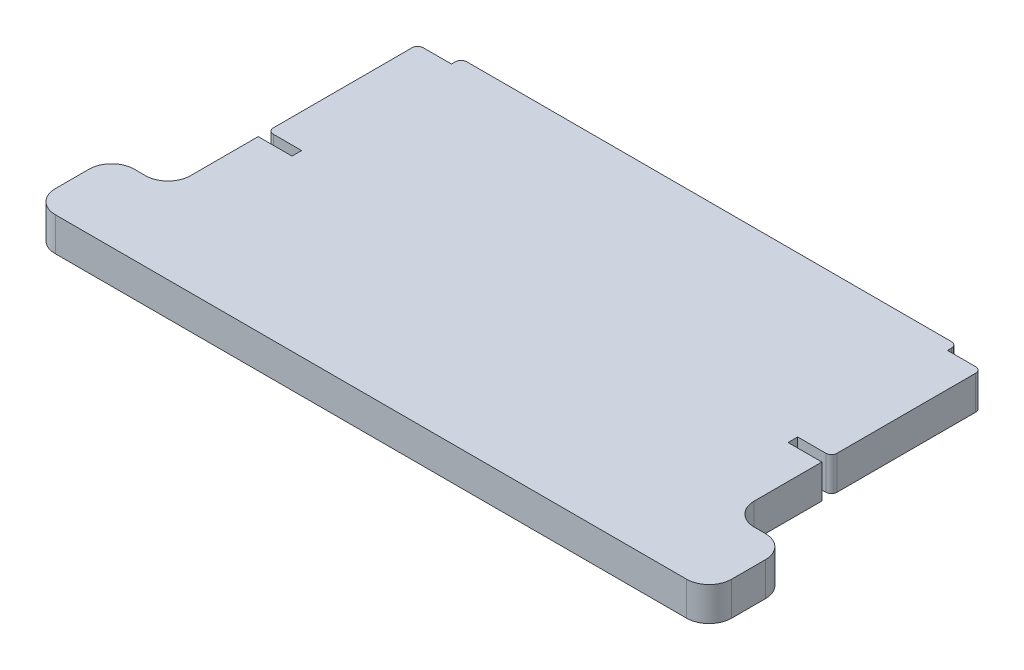
ISO-10303-21;
HEADER;
FILE_DESCRIPTION(('STEP AP214'),'2;1');
FILE_NAME('part.step','',(''),(''),'','','');
FILE_SCHEMA(('AUTOMOTIVE_DESIGN { 1 0 10303 214 1 1 1 1 }'));
ENDSEC;
DATA;
#1=APPLICATION_CONTEXT('core data for automotive mechanical design processes');
#2=APPLICATION_PROTOCOL_DEFINITION('international standard','automotive_design',2000,#1);
#3=PRODUCT_CONTEXT('',#1,'mechanical');
#4=PRODUCT('Part','Part','',(#3));
#5=PRODUCT_RELATED_PRODUCT_CATEGORY('part','',(#4));
#6=PRODUCT_DEFINITION_FORMATION('','',#4);
#7=PRODUCT_DEFINITION_CONTEXT('part definition',#1,'design');
#8=PRODUCT_DEFINITION('design','',#6,#7);
#9=PRODUCT_DEFINITION_SHAPE('','',#8);
#10=(LENGTH_UNIT() NAMED_UNIT(*) SI_UNIT(.MILLI.,.METRE.));
#11=(NAMED_UNIT(*) PLANE_ANGLE_UNIT() SI_UNIT($,.RADIAN.));
#12=(NAMED_UNIT(*) SI_UNIT($,.STERADIAN.) SOLID_ANGLE_UNIT());
#13=UNCERTAINTY_MEASURE_WITH_UNIT(LENGTH_MEASURE(1.E-05),#10,'distance_accuracy_value','');
#14=(GEOMETRIC_REPRESENTATION_CONTEXT(3) GLOBAL_UNCERTAINTY_ASSIGNED_CONTEXT((#13)) GLOBAL_UNIT_ASSIGNED_CONTEXT((#10,
#11,#12)) REPRESENTATION_CONTEXT('',''));
#15=CARTESIAN_POINT('',(0.,0.,0.));
#16=DIRECTION('',(0.,0.,1.));
#17=DIRECTION('',(1.,0.,0.));
#18=AXIS2_PLACEMENT_3D('',#15,#16,#17);
#19=CARTESIAN_POINT('',(25.,1.5,-15.));
#20=DIRECTION('',(-1.,0.,0.));
#21=DIRECTION('',(0.,0.,1.));
#22=AXIS2_PLACEMENT_3D('',#19,#20,#21);
#23=PLANE('',#22);
#24=DIRECTION('',(0.,0.,-1.));
#25=VECTOR('',#24,1.);
#26=CARTESIAN_POINT('',(25.,-1.5,-15.));
#27=LINE('',#26,#25);
#28=CARTESIAN_POINT('',(25.,-1.5,-1.35319331840469));
#29=VERTEX_POINT('',#28);
#30=CARTESIAN_POINT('',(25.,-1.5,-13.6468066815953));
#31=VERTEX_POINT('',#30);
#32=EDGE_CURVE('E380',#29,#31,#27,.T.);
#33=ORIENTED_EDGE('',*,*,#32,.T.);
#34=DIRECTION('',(0.,1.,0.));
#35=VECTOR('',#34,1.);
#36=CARTESIAN_POINT('',(25.,1.5,-13.6468066815953));
#37=LINE('',#36,#35);
#38=CARTESIAN_POINT('',(25.,1.5,-13.6468066815953));
#39=VERTEX_POINT('',#38);
#40=EDGE_CURVE('E357',#31,#39,#37,.T.);
#41=ORIENTED_EDGE('',*,*,#40,.T.);
#42=DIRECTION('',(0.,0.,-1.));
#43=VECTOR('',#42,1.);
#44=CARTESIAN_POINT('',(25.,1.5,-15.));
#45=LINE('',#44,#43);
#46=CARTESIAN_POINT('',(25.,1.5,-1.35319331840469));
#47=VERTEX_POINT('',#46);
#48=EDGE_CURVE('E296',#47,#39,#45,.T.);
#49=ORIENTED_EDGE('',*,*,#48,.F.);
#50=DIRECTION('',(0.,1.,0.));
#51=VECTOR('',#50,1.);
#52=CARTESIAN_POINT('',(25.,1.5,-1.35319331840469));
#53=LINE('',#52,#51);
#54=EDGE_CURVE('E355',#47,#29,#53,.F.);
#55=ORIENTED_EDGE('',*,*,#54,.T.);
#56=EDGE_LOOP('',(#33,#41,#49,#55));
#57=FACE_BOUND('',#56,.T.);
#58=ADVANCED_FACE('F36',(#57),#23,.F.);
#59=CARTESIAN_POINT('',(-25.,1.5,8.00000000000001));
#60=DIRECTION('',(1.,0.,0.));
#61=DIRECTION('',(0.,0.,-1.));
#62=AXIS2_PLACEMENT_3D('',#59,#60,#61);
#63=PLANE('',#62);
#64=DIRECTION('',(0.,0.,1.));
#65=VECTOR('',#64,1.);
#66=CARTESIAN_POINT('',(-25.,1.5,8.00000000000001));
#67=LINE('',#66,#65);
#68=CARTESIAN_POINT('',(-25.,1.5,-13.6468066815953));
#69=VERTEX_POINT('',#68);
#70=CARTESIAN_POINT('',(-25.,1.5,-1.35319331840469));
#71=VERTEX_POINT('',#70);
#72=EDGE_CURVE('E299',#69,#71,#67,.T.);
#73=ORIENTED_EDGE('',*,*,#72,.F.);
#74=DIRECTION('',(0.,1.,0.));
#75=VECTOR('',#74,1.);
#76=CARTESIAN_POINT('',(-25.,1.5,-13.6468066815953));
#77=LINE('',#76,#75);
#78=CARTESIAN_POINT('',(-25.,-1.5,-13.6468066815953));
#79=VERTEX_POINT('',#78);
#80=EDGE_CURVE('E351',#69,#79,#77,.F.);
#81=ORIENTED_EDGE('',*,*,#80,.T.);
#82=DIRECTION('',(0.,0.,1.));
#83=VECTOR('',#82,1.);
#84=CARTESIAN_POINT('',(-25.,-1.5,8.00000000000001));
#85=LINE('',#84,#83);
#86=CARTESIAN_POINT('',(-25.,-1.5,-1.35319331840469));
#87=VERTEX_POINT('',#86);
#88=EDGE_CURVE('E272',#79,#87,#85,.T.);
#89=ORIENTED_EDGE('',*,*,#88,.T.);
#90=DIRECTION('',(0.,1.,0.));
#91=VECTOR('',#90,1.);
#92=CARTESIAN_POINT('',(-25.,1.5,-1.35319331840469));
#93=LINE('',#92,#91);
#94=EDGE_CURVE('E348',#87,#71,#93,.T.);
#95=ORIENTED_EDGE('',*,*,#94,.T.);
#96=EDGE_LOOP('',(#73,#81,#89,#95));
#97=FACE_BOUND('',#96,.T.);
#98=ADVANCED_FACE('F471',(#97),#63,.F.);
#99=CARTESIAN_POINT('',(25.,1.5,6.00000000000001));
#100=VERTEX_POINT('',#99);
#101=CARTESIAN_POINT('',(25.,1.5,0.));
#102=VERTEX_POINT('',#101);
#103=EDGE_CURVE('E301',#100,#102,#45,.T.);
#104=ORIENTED_EDGE('',*,*,#103,.F.);
#105=DIRECTION('',(0.,-1.,0.));
#106=VECTOR('',#105,1.);
#107=CARTESIAN_POINT('',(25.,-1.5,6.00000000000001));
#108=LINE('',#107,#106);
#109=CARTESIAN_POINT('',(25.,-1.5,6.00000000000001));
#110=VERTEX_POINT('',#109);
#111=EDGE_CURVE('E548',#100,#110,#108,.T.);
#112=ORIENTED_EDGE('',*,*,#111,.T.);
#113=CARTESIAN_POINT('',(25.,-1.5,0.));
#114=VERTEX_POINT('',#113);
#115=EDGE_CURVE('E278',#110,#114,#27,.T.);
#116=ORIENTED_EDGE('',*,*,#115,.T.);
#117=DIRECTION('',(0.,1.,0.));
#118=VECTOR('',#117,1.);
#119=CARTESIAN_POINT('',(25.,-1.5,0.));
#120=LINE('',#119,#118);
#121=EDGE_CURVE('E423',#114,#102,#120,.T.);
#122=ORIENTED_EDGE('',*,*,#121,.T.);
#123=EDGE_LOOP('',(#104,#112,#116,#122));
#124=FACE_BOUND('',#123,.T.);
#125=ADVANCED_FACE('F565',(#124),#23,.F.);
#126=CARTESIAN_POINT('',(-25.,1.5,-15.));
#127=DIRECTION('',(0.,0.,1.));
#128=DIRECTION('',(1.,0.,0.));
#129=AXIS2_PLACEMENT_3D('',#126,#127,#128);
#130=PLANE('',#129);
#131=DIRECTION('',(-1.,0.,0.));
#132=VECTOR('',#131,1.);
#133=CARTESIAN_POINT('',(-25.,-1.5,-15.));
#134=LINE('',#133,#132);
#135=CARTESIAN_POINT('',(21.5,-1.5,-15.));
#136=VERTEX_POINT('',#135);
#137=CARTESIAN_POINT('',(-21.5,-1.5,-15.));
#138=VERTEX_POINT('',#137);
#139=EDGE_CURVE('E273',#136,#138,#134,.T.);
#140=ORIENTED_EDGE('',*,*,#139,.T.);
#141=DIRECTION('',(0.,1.,0.));
#142=VECTOR('',#141,1.);
#143=CARTESIAN_POINT('',(-21.5,1.5,-15.));
#144=LINE('',#143,#142);
#145=CARTESIAN_POINT('',(-21.5,1.5,-15.));
#146=VERTEX_POINT('',#145);
#147=EDGE_CURVE('E320',#138,#146,#144,.T.);
#148=ORIENTED_EDGE('',*,*,#147,.T.);
#149=DIRECTION('',(-1.,0.,0.));
#150=VECTOR('',#149,1.);
#151=CARTESIAN_POINT('',(-25.,1.5,-15.));
#152=LINE('',#151,#150);
#153=CARTESIAN_POINT('',(21.5,1.5,-15.));
#154=VERTEX_POINT('',#153);
#155=EDGE_CURVE('E300',#154,#146,#152,.T.);
#156=ORIENTED_EDGE('',*,*,#155,.F.);
#157=DIRECTION('',(0.,1.,0.));
#158=VECTOR('',#157,1.);
#159=CARTESIAN_POINT('',(21.5,1.5,-15.));
#160=LINE('',#159,#158);
#161=EDGE_CURVE('E496',#154,#136,#160,.F.);
#162=ORIENTED_EDGE('',*,*,#161,.T.);
#163=EDGE_LOOP('',(#140,#148,#156,#162));
#164=FACE_BOUND('',#163,.T.);
#165=ADVANCED_FACE('F493',(#164),#130,.F.);
#166=CARTESIAN_POINT('',(-25.,-1.5,0.));
#167=VERTEX_POINT('',#166);
#168=CARTESIAN_POINT('',(-25.,-1.5,6.00000000000001));
#169=VERTEX_POINT('',#168);
#170=EDGE_CURVE('E262',#167,#169,#85,.T.);
#171=ORIENTED_EDGE('',*,*,#170,.T.);
#172=DIRECTION('',(0.,-1.,0.));
#173=VECTOR('',#172,1.);
#174=CARTESIAN_POINT('',(-25.,1.5,6.00000000000001));
#175=LINE('',#174,#173);
#176=CARTESIAN_POINT('',(-25.,1.5,6.00000000000001));
#177=VERTEX_POINT('',#176);
#178=EDGE_CURVE('E506',#169,#177,#175,.F.);
#179=ORIENTED_EDGE('',*,*,#178,.T.);
#180=CARTESIAN_POINT('',(-25.,1.5,0.));
#181=VERTEX_POINT('',#180);
#182=EDGE_CURVE('E265',#181,#177,#67,.T.);
#183=ORIENTED_EDGE('',*,*,#182,.F.);
#184=DIRECTION('',(0.,1.,0.));
#185=VECTOR('',#184,1.);
#186=CARTESIAN_POINT('',(-25.,-1.5,0.));
#187=LINE('',#186,#185);
#188=EDGE_CURVE('E249',#167,#181,#187,.T.);
#189=ORIENTED_EDGE('',*,*,#188,.F.);
#190=EDGE_LOOP('',(#171,#179,#183,#189));
#191=FACE_BOUND('',#190,.T.);
#192=ADVANCED_FACE('F261',(#191),#63,.F.);
#193=CARTESIAN_POINT('',(-30.,1.5,8.00000000000001));
#194=DIRECTION('',(0.,0.,1.));
#195=DIRECTION('',(1.,0.,0.));
#196=AXIS2_PLACEMENT_3D('',#193,#194,#195);
#197=PLANE('',#196);
#198=DIRECTION('',(-1.,0.,0.));
#199=VECTOR('',#198,1.);
#200=CARTESIAN_POINT('',(-30.,-1.5,8.00000000000001));
#201=LINE('',#200,#199);
#202=CARTESIAN_POINT('',(-27.,-1.5,8.00000000000001));
#203=VERTEX_POINT('',#202);
#204=CARTESIAN_POINT('',(-28.,-1.5,8.00000000000001));
#205=VERTEX_POINT('',#204);
#206=EDGE_CURVE('E276',#203,#205,#201,.T.);
#207=ORIENTED_EDGE('',*,*,#206,.T.);
#208=DIRECTION('',(0.,-1.,0.));
#209=VECTOR('',#208,1.);
#210=CARTESIAN_POINT('',(-28.,1.5,8.00000000000001));
#211=LINE('',#210,#209);
#212=CARTESIAN_POINT('',(-28.,1.5,8.00000000000001));
#213=VERTEX_POINT('',#212);
#214=EDGE_CURVE('E508',#205,#213,#211,.F.);
#215=ORIENTED_EDGE('',*,*,#214,.T.);
#216=DIRECTION('',(-1.,0.,0.));
#217=VECTOR('',#216,1.);
#218=CARTESIAN_POINT('',(-30.,1.5,8.00000000000001));
#219=LINE('',#218,#217);
#220=CARTESIAN_POINT('',(-27.,1.5,8.00000000000001));
#221=VERTEX_POINT('',#220);
#222=EDGE_CURVE('E307',#221,#213,#219,.T.);
#223=ORIENTED_EDGE('',*,*,#222,.F.);
#224=DIRECTION('',(0.,-1.,0.));
#225=VECTOR('',#224,1.);
#226=CARTESIAN_POINT('',(-27.,-1.5,8.00000000000001));
#227=LINE('',#226,#225);
#228=EDGE_CURVE('E510',#221,#203,#227,.T.);
#229=ORIENTED_EDGE('',*,*,#228,.T.);
#230=EDGE_LOOP('',(#207,#215,#223,#229));
#231=FACE_BOUND('',#230,.T.);
#232=ADVANCED_FACE('F617',(#231),#197,.F.);
#233=CARTESIAN_POINT('',(-30.,1.5,15.));
#234=DIRECTION('',(1.,0.,0.));
#235=DIRECTION('',(0.,0.,-1.));
#236=AXIS2_PLACEMENT_3D('',#233,#234,#235);
#237=PLANE('',#236);
#238=DIRECTION('',(0.,0.,1.));
#239=VECTOR('',#238,1.);
#240=CARTESIAN_POINT('',(-30.,-1.5,15.));
#241=LINE('',#240,#239);
#242=CARTESIAN_POINT('',(-30.,-1.5,10.));
#243=VERTEX_POINT('',#242);
#244=CARTESIAN_POINT('',(-30.,-1.5,13.));
#245=VERTEX_POINT('',#244);
#246=EDGE_CURVE('E284',#243,#245,#241,.T.);
#247=ORIENTED_EDGE('',*,*,#246,.T.);
#248=DIRECTION('',(0.,-1.,0.));
#249=VECTOR('',#248,1.);
#250=CARTESIAN_POINT('',(-30.,1.5,13.));
#251=LINE('',#250,#249);
#252=CARTESIAN_POINT('',(-30.,1.5,13.));
#253=VERTEX_POINT('',#252);
#254=EDGE_CURVE('E513',#245,#253,#251,.F.);
#255=ORIENTED_EDGE('',*,*,#254,.T.);
#256=DIRECTION('',(0.,0.,1.));
#257=VECTOR('',#256,1.);
#258=CARTESIAN_POINT('',(-30.,1.5,15.));
#259=LINE('',#258,#257);
#260=CARTESIAN_POINT('',(-30.,1.5,10.));
#261=VERTEX_POINT('',#260);
#262=EDGE_CURVE('E611',#261,#253,#259,.T.);
#263=ORIENTED_EDGE('',*,*,#262,.F.);
#264=DIRECTION('',(0.,-1.,0.));
#265=VECTOR('',#264,1.);
#266=CARTESIAN_POINT('',(-30.,1.5,10.));
#267=LINE('',#266,#265);
#268=EDGE_CURVE('E515',#261,#243,#267,.T.);
#269=ORIENTED_EDGE('',*,*,#268,.T.);
#270=EDGE_LOOP('',(#247,#255,#263,#269));
#271=FACE_BOUND('',#270,.T.);
#272=ADVANCED_FACE('F607',(#271),#237,.F.);
#273=CARTESIAN_POINT('',(30.,1.5,15.));
#274=DIRECTION('',(0.,0.,-1.));
#275=DIRECTION('',(-1.,0.,0.));
#276=AXIS2_PLACEMENT_3D('',#273,#274,#275);
#277=PLANE('',#276);
#278=DIRECTION('',(1.,0.,0.));
#279=VECTOR('',#278,1.);
#280=CARTESIAN_POINT('',(30.,-1.5,15.));
#281=LINE('',#280,#279);
#282=CARTESIAN_POINT('',(-28.,-1.5,15.));
#283=VERTEX_POINT('',#282);
#284=CARTESIAN_POINT('',(28.,-1.5,15.));
#285=VERTEX_POINT('',#284);
#286=EDGE_CURVE('E287',#283,#285,#281,.T.);
#287=ORIENTED_EDGE('',*,*,#286,.T.);
#288=DIRECTION('',(0.,-1.,0.));
#289=VECTOR('',#288,1.);
#290=CARTESIAN_POINT('',(28.,1.5,15.));
#291=LINE('',#290,#289);
#292=CARTESIAN_POINT('',(28.,1.5,14.9999999999999));
#293=VERTEX_POINT('',#292);
#294=EDGE_CURVE('E518',#285,#293,#291,.F.);
#295=ORIENTED_EDGE('',*,*,#294,.T.);
#296=DIRECTION('',(1.,0.,0.));
#297=VECTOR('',#296,1.);
#298=CARTESIAN_POINT('',(-25.,1.5,15.));
#299=LINE('',#298,#297);
#300=CARTESIAN_POINT('',(-28.,1.5,15.));
#301=VERTEX_POINT('',#300);
#302=EDGE_CURVE('E561',#301,#293,#299,.T.);
#303=ORIENTED_EDGE('',*,*,#302,.F.);
#304=DIRECTION('',(0.,-1.,0.));
#305=VECTOR('',#304,1.);
#306=CARTESIAN_POINT('',(-28.,1.5,15.));
#307=LINE('',#306,#305);
#308=EDGE_CURVE('E520',#301,#283,#307,.T.);
#309=ORIENTED_EDGE('',*,*,#308,.T.);
#310=EDGE_LOOP('',(#287,#295,#303,#309));
#311=FACE_BOUND('',#310,.T.);
#312=ADVANCED_FACE('F597',(#311),#277,.F.);
#313=CARTESIAN_POINT('',(30.,1.5,8.00000000000001));
#314=DIRECTION('',(-1.,0.,0.));
#315=DIRECTION('',(0.,0.,1.));
#316=AXIS2_PLACEMENT_3D('',#313,#314,#315);
#317=PLANE('',#316);
#318=DIRECTION('',(0.,0.,-1.));
#319=VECTOR('',#318,1.);
#320=CARTESIAN_POINT('',(30.,-1.5,8.00000000000001));
#321=LINE('',#320,#319);
#322=CARTESIAN_POINT('',(30.,-1.5,13.));
#323=VERTEX_POINT('',#322);
#324=CARTESIAN_POINT('',(30.,-1.5,10.));
#325=VERTEX_POINT('',#324);
#326=EDGE_CURVE('E290',#323,#325,#321,.T.);
#327=ORIENTED_EDGE('',*,*,#326,.T.);
#328=DIRECTION('',(0.,-1.,0.));
#329=VECTOR('',#328,1.);
#330=CARTESIAN_POINT('',(30.,1.5,10.));
#331=LINE('',#330,#329);
#332=CARTESIAN_POINT('',(30.,1.5,10.));
#333=VERTEX_POINT('',#332);
#334=EDGE_CURVE('E531',#325,#333,#331,.F.);
#335=ORIENTED_EDGE('',*,*,#334,.T.);
#336=DIRECTION('',(0.,0.,-1.));
#337=VECTOR('',#336,1.);
#338=CARTESIAN_POINT('',(30.,1.5,8.00000000000001));
#339=LINE('',#338,#337);
#340=CARTESIAN_POINT('',(30.,1.5,13.));
#341=VERTEX_POINT('',#340);
#342=EDGE_CURVE('E556',#341,#333,#339,.T.);
#343=ORIENTED_EDGE('',*,*,#342,.F.);
#344=DIRECTION('',(0.,-1.,0.));
#345=VECTOR('',#344,1.);
#346=CARTESIAN_POINT('',(30.,1.5,13.));
#347=LINE('',#346,#345);
#348=EDGE_CURVE('E533',#341,#323,#347,.T.);
#349=ORIENTED_EDGE('',*,*,#348,.T.);
#350=EDGE_LOOP('',(#327,#335,#343,#349));
#351=FACE_BOUND('',#350,.T.);
#352=ADVANCED_FACE('F588',(#351),#317,.F.);
#353=CARTESIAN_POINT('',(25.,1.5,8.00000000000001));
#354=DIRECTION('',(0.,0.,1.));
#355=DIRECTION('',(1.,0.,0.));
#356=AXIS2_PLACEMENT_3D('',#353,#354,#355);
#357=PLANE('',#356);
#358=DIRECTION('',(-1.,0.,0.));
#359=VECTOR('',#358,1.);
#360=CARTESIAN_POINT('',(25.,-1.5,8.00000000000001));
#361=LINE('',#360,#359);
#362=CARTESIAN_POINT('',(28.,-1.5,8.00000000000001));
#363=VERTEX_POINT('',#362);
#364=CARTESIAN_POINT('',(27.,-1.5,8.00000000000001));
#365=VERTEX_POINT('',#364);
#366=EDGE_CURVE('E293',#363,#365,#361,.T.);
#367=ORIENTED_EDGE('',*,*,#366,.T.);
#368=DIRECTION('',(0.,-1.,0.));
#369=VECTOR('',#368,1.);
#370=CARTESIAN_POINT('',(27.,1.5,8.00000000000001));
#371=LINE('',#370,#369);
#372=CARTESIAN_POINT('',(27.,1.5,8.00000000000001));
#373=VERTEX_POINT('',#372);
#374=EDGE_CURVE('E544',#365,#373,#371,.F.);
#375=ORIENTED_EDGE('',*,*,#374,.T.);
#376=DIRECTION('',(-1.,0.,0.));
#377=VECTOR('',#376,1.);
#378=CARTESIAN_POINT('',(25.,1.5,8.00000000000001));
#379=LINE('',#378,#377);
#380=CARTESIAN_POINT('',(28.,1.5,8.00000000000001));
#381=VERTEX_POINT('',#380);
#382=EDGE_CURVE('E550',#381,#373,#379,.T.);
#383=ORIENTED_EDGE('',*,*,#382,.F.);
#384=DIRECTION('',(0.,-1.,0.));
#385=VECTOR('',#384,1.);
#386=CARTESIAN_POINT('',(28.,1.5,8.00000000000001));
#387=LINE('',#386,#385);
#388=EDGE_CURVE('E546',#381,#363,#387,.T.);
#389=ORIENTED_EDGE('',*,*,#388,.T.);
#390=EDGE_LOOP('',(#367,#375,#383,#389));
#391=FACE_BOUND('',#390,.T.);
#392=ADVANCED_FACE('F580',(#391),#357,.F.);
#393=CARTESIAN_POINT('',(0.,1.5,0.));
#394=DIRECTION('',(0.,1.,0.));
#395=DIRECTION('',(0.,0.,1.));
#396=AXIS2_PLACEMENT_3D('',#393,#394,#395);
#397=PLANE('',#396);
#398=ORIENTED_EDGE('',*,*,#155,.T.);
#399=CARTESIAN_POINT('',(-21.5,1.5,-14.5));
#400=DIRECTION('',(0.,1.,0.));
#401=DIRECTION('',(0.,0.,1.));
#402=AXIS2_PLACEMENT_3D('',#399,#400,#401);
#403=CIRCLE('',#402,0.5);
#404=CARTESIAN_POINT('',(-22.,1.5,-14.5));
#405=VERTEX_POINT('',#404);
#406=EDGE_CURVE('E328',#146,#405,#403,.T.);
#407=ORIENTED_EDGE('',*,*,#406,.T.);
#408=DIRECTION('',(0.,0.,-1.));
#409=VECTOR('',#408,1.);
#410=CARTESIAN_POINT('',(-22.,1.5,0.));
#411=LINE('',#410,#409);
#412=CARTESIAN_POINT('',(-22.,1.5,-14.1468066815953));
#413=VERTEX_POINT('',#412);
#414=EDGE_CURVE('E391',#413,#405,#411,.T.);
#415=ORIENTED_EDGE('',*,*,#414,.F.);
#416=DIRECTION('',(1.,0.,0.));
#417=VECTOR('',#416,1.);
#418=CARTESIAN_POINT('',(0.,1.5,-14.1468066815953));
#419=LINE('',#418,#417);
#420=CARTESIAN_POINT('',(-24.5,1.5,-14.1468066815953));
#421=VERTEX_POINT('',#420);
#422=EDGE_CURVE('E314',#421,#413,#419,.T.);
#423=ORIENTED_EDGE('',*,*,#422,.F.);
#424=CARTESIAN_POINT('',(-24.5,1.5,-13.6468066815953));
#425=DIRECTION('',(0.,1.,0.));
#426=DIRECTION('',(0.,0.,1.));
#427=AXIS2_PLACEMENT_3D('',#424,#425,#426);
#428=CIRCLE('',#427,0.5);
#429=EDGE_CURVE('E324',#421,#69,#428,.T.);
#430=ORIENTED_EDGE('',*,*,#429,.T.);
#431=ORIENTED_EDGE('',*,*,#72,.T.);
#432=CARTESIAN_POINT('',(-24.5,1.5,-1.35319331840469));
#433=DIRECTION('',(0.,1.,0.));
#434=DIRECTION('',(0.,0.,1.));
#435=AXIS2_PLACEMENT_3D('',#432,#433,#434);
#436=CIRCLE('',#435,0.5);
#437=CARTESIAN_POINT('',(-24.5,1.5,-0.853193318404694));
#438=VERTEX_POINT('',#437);
#439=EDGE_CURVE('E322',#71,#438,#436,.T.);
#440=ORIENTED_EDGE('',*,*,#439,.T.);
#441=DIRECTION('',(-1.,0.,0.));
#442=VECTOR('',#441,1.);
#443=CARTESIAN_POINT('',(0.,1.5,-0.853193318404694));
#444=LINE('',#443,#442);
#445=CARTESIAN_POINT('',(-22.,1.5,-0.853193318404694));
#446=VERTEX_POINT('',#445);
#447=EDGE_CURVE('E398',#446,#438,#444,.T.);
#448=ORIENTED_EDGE('',*,*,#447,.F.);
#449=DIRECTION('',(0.,0.,-1.));
#450=VECTOR('',#449,1.);
#451=CARTESIAN_POINT('',(-22.,1.5,0.));
#452=LINE('',#451,#450);
#453=CARTESIAN_POINT('',(-22.,1.5,0.));
#454=VERTEX_POINT('',#453);
#455=EDGE_CURVE('E401',#454,#446,#452,.T.);
#456=ORIENTED_EDGE('',*,*,#455,.F.);
#457=DIRECTION('',(1.,0.,0.));
#458=VECTOR('',#457,1.);
#459=CARTESIAN_POINT('',(0.,1.5,0.));
#460=LINE('',#459,#458);
#461=EDGE_CURVE('E403',#181,#454,#460,.T.);
#462=ORIENTED_EDGE('',*,*,#461,.F.);
#463=ORIENTED_EDGE('',*,*,#182,.T.);
#464=CARTESIAN_POINT('',(-27.,1.5,6.00000000000001));
#465=DIRECTION('',(0.,1.,0.));
#466=DIRECTION('',(0.,0.,1.));
#467=AXIS2_PLACEMENT_3D('',#464,#465,#466);
#468=CIRCLE('',#467,2.);
#469=EDGE_CURVE('E497',#177,#221,#468,.F.);
#470=ORIENTED_EDGE('',*,*,#469,.T.);
#471=ORIENTED_EDGE('',*,*,#222,.T.);
#472=CARTESIAN_POINT('',(-28.,1.5,10.));
#473=DIRECTION('',(0.,1.,0.));
#474=DIRECTION('',(0.,0.,1.));
#475=AXIS2_PLACEMENT_3D('',#472,#473,#474);
#476=CIRCLE('',#475,2.);
#477=EDGE_CURVE('E529',#213,#261,#476,.T.);
#478=ORIENTED_EDGE('',*,*,#477,.T.);
#479=ORIENTED_EDGE('',*,*,#262,.T.);
#480=CARTESIAN_POINT('',(-28.,1.5,13.));
#481=DIRECTION('',(0.,1.,0.));
#482=DIRECTION('',(0.,0.,1.));
#483=AXIS2_PLACEMENT_3D('',#480,#481,#482);
#484=CIRCLE('',#483,2.);
#485=EDGE_CURVE('E527',#253,#301,#484,.T.);
#486=ORIENTED_EDGE('',*,*,#485,.T.);
#487=ORIENTED_EDGE('',*,*,#302,.T.);
#488=CARTESIAN_POINT('',(28.,1.5,13.));
#489=DIRECTION('',(0.,1.,0.));
#490=DIRECTION('',(0.,0.,1.));
#491=AXIS2_PLACEMENT_3D('',#488,#489,#490);
#492=CIRCLE('',#491,2.);
#493=EDGE_CURVE('E525',#293,#341,#492,.T.);
#494=ORIENTED_EDGE('',*,*,#493,.T.);
#495=ORIENTED_EDGE('',*,*,#342,.T.);
#496=CARTESIAN_POINT('',(28.,1.5,10.));
#497=DIRECTION('',(0.,1.,0.));
#498=DIRECTION('',(0.,0.,1.));
#499=AXIS2_PLACEMENT_3D('',#496,#497,#498);
#500=CIRCLE('',#499,2.);
#501=EDGE_CURVE('E523',#333,#381,#500,.T.);
#502=ORIENTED_EDGE('',*,*,#501,.T.);
#503=ORIENTED_EDGE('',*,*,#382,.T.);
#504=CARTESIAN_POINT('',(27.,1.5,6.00000000000001));
#505=DIRECTION('',(0.,1.,0.));
#506=DIRECTION('',(0.,0.,1.));
#507=AXIS2_PLACEMENT_3D('',#504,#505,#506);
#508=CIRCLE('',#507,2.);
#509=EDGE_CURVE('E502',#373,#100,#508,.F.);
#510=ORIENTED_EDGE('',*,*,#509,.T.);
#511=ORIENTED_EDGE('',*,*,#103,.T.);
#512=DIRECTION('',(1.,0.,0.));
#513=VECTOR('',#512,1.);
#514=CARTESIAN_POINT('',(0.,1.5,0.));
#515=LINE('',#514,#513);
#516=CARTESIAN_POINT('',(22.,1.5,0.));
#517=VERTEX_POINT('',#516);
#518=EDGE_CURVE('E413',#517,#102,#515,.T.);
#519=ORIENTED_EDGE('',*,*,#518,.F.);
#520=DIRECTION('',(0.,0.,1.));
#521=VECTOR('',#520,1.);
#522=CARTESIAN_POINT('',(22.,1.5,0.));
#523=LINE('',#522,#521);
#524=CARTESIAN_POINT('',(22.,1.5,-0.853193318404694));
#525=VERTEX_POINT('',#524);
#526=EDGE_CURVE('E418',#525,#517,#523,.T.);
#527=ORIENTED_EDGE('',*,*,#526,.F.);
#528=DIRECTION('',(-1.,0.,0.));
#529=VECTOR('',#528,1.);
#530=CARTESIAN_POINT('',(0.,1.5,-0.853193318404694));
#531=LINE('',#530,#529);
#532=CARTESIAN_POINT('',(24.5,1.5,-0.853193318404694));
#533=VERTEX_POINT('',#532);
#534=EDGE_CURVE('E386',#533,#525,#531,.T.);
#535=ORIENTED_EDGE('',*,*,#534,.F.);
#536=CARTESIAN_POINT('',(24.5,1.5,-1.35319331840469));
#537=DIRECTION('',(0.,1.,0.));
#538=DIRECTION('',(0.,0.,1.));
#539=AXIS2_PLACEMENT_3D('',#536,#537,#538);
#540=CIRCLE('',#539,0.5);
#541=EDGE_CURVE('E317',#533,#47,#540,.T.);
#542=ORIENTED_EDGE('',*,*,#541,.T.);
#543=ORIENTED_EDGE('',*,*,#48,.T.);
#544=CARTESIAN_POINT('',(24.5,1.5,-13.6468066815953));
#545=DIRECTION('',(0.,1.,0.));
#546=DIRECTION('',(0.,0.,1.));
#547=AXIS2_PLACEMENT_3D('',#544,#545,#546);
#548=CIRCLE('',#547,0.5);
#549=CARTESIAN_POINT('',(24.5,1.5,-14.1468066815953));
#550=VERTEX_POINT('',#549);
#551=EDGE_CURVE('E319',#39,#550,#548,.T.);
#552=ORIENTED_EDGE('',*,*,#551,.T.);
#553=DIRECTION('',(1.,0.,0.));
#554=VECTOR('',#553,1.);
#555=CARTESIAN_POINT('',(0.,1.5,-14.1468066815953));
#556=LINE('',#555,#554);
#557=CARTESIAN_POINT('',(22.,1.5,-14.1468066815953));
#558=VERTEX_POINT('',#557);
#559=EDGE_CURVE('E368',#558,#550,#556,.T.);
#560=ORIENTED_EDGE('',*,*,#559,.F.);
#561=DIRECTION('',(0.,0.,1.));
#562=VECTOR('',#561,1.);
#563=CARTESIAN_POINT('',(22.,1.5,0.));
#564=LINE('',#563,#562);
#565=CARTESIAN_POINT('',(22.,1.5,-14.5));
#566=VERTEX_POINT('',#565);
#567=EDGE_CURVE('E411',#566,#558,#564,.T.);
#568=ORIENTED_EDGE('',*,*,#567,.F.);
#569=CARTESIAN_POINT('',(21.5,1.5,-14.5));
#570=DIRECTION('',(0.,1.,0.));
#571=DIRECTION('',(0.,0.,1.));
#572=AXIS2_PLACEMENT_3D('',#569,#570,#571);
#573=CIRCLE('',#572,0.5);
#574=EDGE_CURVE('E326',#566,#154,#573,.T.);
#575=ORIENTED_EDGE('',*,*,#574,.T.);
#576=EDGE_LOOP('',(#398,#407,#415,#423,#430,#431,#440,#448,#456,#462,#463,#470,#471,#478,#479,
#486,#487,#494,#495,#502,#503,#510,#511,#519,#527,#535,#542,#543,#552,#560,#568,#575));
#577=FACE_BOUND('',#576,.T.);
#578=ADVANCED_FACE('F383',(#577),#397,.T.);
#579=CARTESIAN_POINT('',(0.,-1.5,0.));
#580=DIRECTION('',(0.,1.,0.));
#581=DIRECTION('',(0.,0.,1.));
#582=AXIS2_PLACEMENT_3D('',#579,#580,#581);
#583=PLANE('',#582);
#584=DIRECTION('',(0.,0.,-1.));
#585=VECTOR('',#584,1.);
#586=CARTESIAN_POINT('',(-22.,-1.5,-14.1468066815953));
#587=LINE('',#586,#585);
#588=CARTESIAN_POINT('',(-22.,-1.5,-14.1468066815953));
#589=VERTEX_POINT('',#588);
#590=CARTESIAN_POINT('',(-22.,-1.5,-14.5));
#591=VERTEX_POINT('',#590);
#592=EDGE_CURVE('E266',#589,#591,#587,.T.);
#593=ORIENTED_EDGE('',*,*,#592,.T.);
#594=CARTESIAN_POINT('',(-21.5,-1.5,-14.5));
#595=DIRECTION('',(0.,1.,0.));
#596=DIRECTION('',(0.,0.,1.));
#597=AXIS2_PLACEMENT_3D('',#594,#595,#596);
#598=CIRCLE('',#597,0.5);
#599=EDGE_CURVE('E340',#591,#138,#598,.F.);
#600=ORIENTED_EDGE('',*,*,#599,.T.);
#601=ORIENTED_EDGE('',*,*,#139,.F.);
#602=CARTESIAN_POINT('',(21.5,-1.5,-14.5));
#603=DIRECTION('',(0.,1.,0.));
#604=DIRECTION('',(0.,0.,1.));
#605=AXIS2_PLACEMENT_3D('',#602,#603,#604);
#606=CIRCLE('',#605,0.5);
#607=CARTESIAN_POINT('',(22.,-1.5,-14.5));
#608=VERTEX_POINT('',#607);
#609=EDGE_CURVE('E338',#136,#608,#606,.F.);
#610=ORIENTED_EDGE('',*,*,#609,.T.);
#611=DIRECTION('',(0.,0.,1.));
#612=VECTOR('',#611,1.);
#613=CARTESIAN_POINT('',(22.,-1.5,-14.1468066815953));
#614=LINE('',#613,#612);
#615=CARTESIAN_POINT('',(22.,-1.5,-14.1468066815953));
#616=VERTEX_POINT('',#615);
#617=EDGE_CURVE('E371',#608,#616,#614,.T.);
#618=ORIENTED_EDGE('',*,*,#617,.T.);
#619=DIRECTION('',(1.,0.,0.));
#620=VECTOR('',#619,1.);
#621=CARTESIAN_POINT('',(25.,-1.5,-14.1468066815953));
#622=LINE('',#621,#620);
#623=CARTESIAN_POINT('',(24.5,-1.5,-14.1468066815953));
#624=VERTEX_POINT('',#623);
#625=EDGE_CURVE('E365',#616,#624,#622,.T.);
#626=ORIENTED_EDGE('',*,*,#625,.T.);
#627=CARTESIAN_POINT('',(24.5,-1.5,-13.6468066815953));
#628=DIRECTION('',(0.,1.,0.));
#629=DIRECTION('',(0.,0.,1.));
#630=AXIS2_PLACEMENT_3D('',#627,#628,#629);
#631=CIRCLE('',#630,0.5);
#632=EDGE_CURVE('E57',#624,#31,#631,.F.);
#633=ORIENTED_EDGE('',*,*,#632,.T.);
#634=ORIENTED_EDGE('',*,*,#32,.F.);
#635=CARTESIAN_POINT('',(24.5,-1.5,-1.35319331840469));
#636=DIRECTION('',(0.,1.,0.));
#637=DIRECTION('',(0.,0.,1.));
#638=AXIS2_PLACEMENT_3D('',#635,#636,#637);
#639=CIRCLE('',#638,0.5);
#640=CARTESIAN_POINT('',(24.5,-1.5,-0.853193318404694));
#641=VERTEX_POINT('',#640);
#642=EDGE_CURVE('E51',#29,#641,#639,.F.);
#643=ORIENTED_EDGE('',*,*,#642,.T.);
#644=DIRECTION('',(-1.,0.,0.));
#645=VECTOR('',#644,1.);
#646=CARTESIAN_POINT('',(25.,-1.5,-0.853193318404694));
#647=LINE('',#646,#645);
#648=CARTESIAN_POINT('',(22.,-1.5,-0.853193318404694));
#649=VERTEX_POINT('',#648);
#650=EDGE_CURVE('E439',#641,#649,#647,.T.);
#651=ORIENTED_EDGE('',*,*,#650,.T.);
#652=DIRECTION('',(0.,0.,1.));
#653=VECTOR('',#652,1.);
#654=CARTESIAN_POINT('',(22.,-1.5,-0.853193318404694));
#655=LINE('',#654,#653);
#656=CARTESIAN_POINT('',(22.,-1.5,0.));
#657=VERTEX_POINT('',#656);
#658=EDGE_CURVE('E436',#649,#657,#655,.T.);
#659=ORIENTED_EDGE('',*,*,#658,.T.);
#660=DIRECTION('',(1.,0.,0.));
#661=VECTOR('',#660,1.);
#662=CARTESIAN_POINT('',(22.,-1.5,0.));
#663=LINE('',#662,#661);
#664=EDGE_CURVE('E433',#657,#114,#663,.T.);
#665=ORIENTED_EDGE('',*,*,#664,.T.);
#666=ORIENTED_EDGE('',*,*,#115,.F.);
#667=CARTESIAN_POINT('',(27.,-1.5,6.00000000000001));
#668=DIRECTION('',(0.,1.,0.));
#669=DIRECTION('',(0.,0.,1.));
#670=AXIS2_PLACEMENT_3D('',#667,#668,#669);
#671=CIRCLE('',#670,2.);
#672=EDGE_CURVE('E504',#110,#365,#671,.T.);
#673=ORIENTED_EDGE('',*,*,#672,.T.);
#674=ORIENTED_EDGE('',*,*,#366,.F.);
#675=CARTESIAN_POINT('',(28.,-1.5,10.));
#676=DIRECTION('',(0.,1.,0.));
#677=DIRECTION('',(0.,0.,1.));
#678=AXIS2_PLACEMENT_3D('',#675,#676,#677);
#679=CIRCLE('',#678,2.);
#680=EDGE_CURVE('E536',#363,#325,#679,.F.);
#681=ORIENTED_EDGE('',*,*,#680,.T.);
#682=ORIENTED_EDGE('',*,*,#326,.F.);
#683=CARTESIAN_POINT('',(28.,-1.5,13.));
#684=DIRECTION('',(0.,1.,0.));
#685=DIRECTION('',(0.,0.,1.));
#686=AXIS2_PLACEMENT_3D('',#683,#684,#685);
#687=CIRCLE('',#686,2.);
#688=EDGE_CURVE('E538',#323,#285,#687,.F.);
#689=ORIENTED_EDGE('',*,*,#688,.T.);
#690=ORIENTED_EDGE('',*,*,#286,.F.);
#691=CARTESIAN_POINT('',(-28.,-1.5,13.));
#692=DIRECTION('',(0.,1.,0.));
#693=DIRECTION('',(0.,0.,1.));
#694=AXIS2_PLACEMENT_3D('',#691,#692,#693);
#695=CIRCLE('',#694,2.);
#696=EDGE_CURVE('E540',#283,#245,#695,.F.);
#697=ORIENTED_EDGE('',*,*,#696,.T.);
#698=ORIENTED_EDGE('',*,*,#246,.F.);
#699=CARTESIAN_POINT('',(-28.,-1.5,10.));
#700=DIRECTION('',(0.,1.,0.));
#701=DIRECTION('',(0.,0.,1.));
#702=AXIS2_PLACEMENT_3D('',#699,#700,#701);
#703=CIRCLE('',#702,2.);
#704=EDGE_CURVE('E542',#243,#205,#703,.F.);
#705=ORIENTED_EDGE('',*,*,#704,.T.);
#706=ORIENTED_EDGE('',*,*,#206,.F.);
#707=CARTESIAN_POINT('',(-27.,-1.5,6.00000000000001));
#708=DIRECTION('',(0.,1.,0.));
#709=DIRECTION('',(0.,0.,1.));
#710=AXIS2_PLACEMENT_3D('',#707,#708,#709);
#711=CIRCLE('',#710,2.);
#712=EDGE_CURVE('E271',#203,#169,#711,.T.);
#713=ORIENTED_EDGE('',*,*,#712,.T.);
#714=ORIENTED_EDGE('',*,*,#170,.F.);
#715=DIRECTION('',(1.,0.,0.));
#716=VECTOR('',#715,1.);
#717=CARTESIAN_POINT('',(-22.,-1.5,0.));
#718=LINE('',#717,#716);
#719=CARTESIAN_POINT('',(-22.,-1.5,0.));
#720=VERTEX_POINT('',#719);
#721=EDGE_CURVE('E246',#167,#720,#718,.T.);
#722=ORIENTED_EDGE('',*,*,#721,.T.);
#723=DIRECTION('',(0.,0.,-1.));
#724=VECTOR('',#723,1.);
#725=CARTESIAN_POINT('',(-22.,-1.5,-0.853193318404694));
#726=LINE('',#725,#724);
#727=CARTESIAN_POINT('',(-22.,-1.5,-0.853193318404694));
#728=VERTEX_POINT('',#727);
#729=EDGE_CURVE('E255',#720,#728,#726,.T.);
#730=ORIENTED_EDGE('',*,*,#729,.T.);
#731=DIRECTION('',(-1.,0.,0.));
#732=VECTOR('',#731,1.);
#733=CARTESIAN_POINT('',(-25.,-1.5,-0.853193318404694));
#734=LINE('',#733,#732);
#735=CARTESIAN_POINT('',(-24.5,-1.5,-0.853193318404694));
#736=VERTEX_POINT('',#735);
#737=EDGE_CURVE('E452',#728,#736,#734,.T.);
#738=ORIENTED_EDGE('',*,*,#737,.T.);
#739=CARTESIAN_POINT('',(-24.5,-1.5,-1.35319331840469));
#740=DIRECTION('',(0.,1.,0.));
#741=DIRECTION('',(0.,0.,1.));
#742=AXIS2_PLACEMENT_3D('',#739,#740,#741);
#743=CIRCLE('',#742,0.5);
#744=EDGE_CURVE('E334',#736,#87,#743,.F.);
#745=ORIENTED_EDGE('',*,*,#744,.T.);
#746=ORIENTED_EDGE('',*,*,#88,.F.);
#747=CARTESIAN_POINT('',(-24.5,-1.5,-13.6468066815953));
#748=DIRECTION('',(0.,1.,0.));
#749=DIRECTION('',(0.,0.,1.));
#750=AXIS2_PLACEMENT_3D('',#747,#748,#749);
#751=CIRCLE('',#750,0.5);
#752=CARTESIAN_POINT('',(-24.5,-1.5,-14.1468066815953));
#753=VERTEX_POINT('',#752);
#754=EDGE_CURVE('E336',#79,#753,#751,.F.);
#755=ORIENTED_EDGE('',*,*,#754,.T.);
#756=DIRECTION('',(1.,0.,0.));
#757=VECTOR('',#756,1.);
#758=CARTESIAN_POINT('',(-25.,-1.5,-14.1468066815953));
#759=LINE('',#758,#757);
#760=EDGE_CURVE('E450',#753,#589,#759,.T.);
#761=ORIENTED_EDGE('',*,*,#760,.T.);
#762=EDGE_LOOP('',(#593,#600,#601,#610,#618,#626,#633,#634,#643,#651,#659,#665,#666,#673,#674,
#681,#682,#689,#690,#697,#698,#705,#706,#713,#714,#722,#730,#738,#745,#746,#755,#761));
#763=FACE_BOUND('',#762,.T.);
#764=ADVANCED_FACE('F269',(#763),#583,.F.);
#765=CARTESIAN_POINT('',(22.,-1.5,-0.853193318404694));
#766=DIRECTION('',(-1.,0.,0.));
#767=DIRECTION('',(0.,0.,1.));
#768=AXIS2_PLACEMENT_3D('',#765,#766,#767);
#769=PLANE('',#768);
#770=ORIENTED_EDGE('',*,*,#526,.T.);
#771=DIRECTION('',(0.,1.,0.));
#772=VECTOR('',#771,1.);
#773=CARTESIAN_POINT('',(22.,-1.5,0.));
#774=LINE('',#773,#772);
#775=EDGE_CURVE('E426',#657,#517,#774,.T.);
#776=ORIENTED_EDGE('',*,*,#775,.F.);
#777=ORIENTED_EDGE('',*,*,#658,.F.);
#778=DIRECTION('',(0.,1.,0.));
#779=VECTOR('',#778,1.);
#780=CARTESIAN_POINT('',(22.,-1.5,-0.853193318404694));
#781=LINE('',#780,#779);
#782=EDGE_CURVE('E372',#649,#525,#781,.T.);
#783=ORIENTED_EDGE('',*,*,#782,.T.);
#784=EDGE_LOOP('',(#770,#776,#777,#783));
#785=FACE_BOUND('',#784,.T.);
#786=ADVANCED_FACE('F573',(#785),#769,.F.);
#787=CARTESIAN_POINT('',(22.,-1.5,0.));
#788=DIRECTION('',(0.,0.,1.));
#789=DIRECTION('',(1.,0.,0.));
#790=AXIS2_PLACEMENT_3D('',#787,#788,#789);
#791=PLANE('',#790);
#792=ORIENTED_EDGE('',*,*,#518,.T.);
#793=ORIENTED_EDGE('',*,*,#121,.F.);
#794=ORIENTED_EDGE('',*,*,#664,.F.);
#795=ORIENTED_EDGE('',*,*,#775,.T.);
#796=EDGE_LOOP('',(#792,#793,#794,#795));
#797=FACE_BOUND('',#796,.T.);
#798=ADVANCED_FACE('F567',(#797),#791,.F.);
#799=CARTESIAN_POINT('',(25.,-1.5,-0.853193318404694));
#800=DIRECTION('',(0.,0.,-1.));
#801=DIRECTION('',(-1.,0.,0.));
#802=AXIS2_PLACEMENT_3D('',#799,#800,#801);
#803=PLANE('',#802);
#804=ORIENTED_EDGE('',*,*,#650,.F.);
#805=DIRECTION('',(0.,1.,0.));
#806=VECTOR('',#805,1.);
#807=CARTESIAN_POINT('',(24.5,-1.5,-0.853193318404694));
#808=LINE('',#807,#806);
#809=EDGE_CURVE('E11',#641,#533,#808,.T.);
#810=ORIENTED_EDGE('',*,*,#809,.T.);
#811=ORIENTED_EDGE('',*,*,#534,.T.);
#812=ORIENTED_EDGE('',*,*,#782,.F.);
#813=EDGE_LOOP('',(#804,#810,#811,#812));
#814=FACE_BOUND('',#813,.T.);
#815=ADVANCED_FACE('F663',(#814),#803,.F.);
#816=CARTESIAN_POINT('',(25.,-1.5,-14.1468066815953));
#817=DIRECTION('',(0.,0.,1.));
#818=DIRECTION('',(1.,0.,0.));
#819=AXIS2_PLACEMENT_3D('',#816,#817,#818);
#820=PLANE('',#819);
#821=ORIENTED_EDGE('',*,*,#559,.T.);
#822=DIRECTION('',(0.,1.,0.));
#823=VECTOR('',#822,1.);
#824=CARTESIAN_POINT('',(24.5,-1.5,-14.1468066815953));
#825=LINE('',#824,#823);
#826=EDGE_CURVE('E44',#550,#624,#825,.F.);
#827=ORIENTED_EDGE('',*,*,#826,.T.);
#828=ORIENTED_EDGE('',*,*,#625,.F.);
#829=DIRECTION('',(0.,1.,0.));
#830=VECTOR('',#829,1.);
#831=CARTESIAN_POINT('',(22.,-1.5,-14.1468066815953));
#832=LINE('',#831,#830);
#833=EDGE_CURVE('E256',#616,#558,#832,.T.);
#834=ORIENTED_EDGE('',*,*,#833,.T.);
#835=EDGE_LOOP('',(#821,#827,#828,#834));
#836=FACE_BOUND('',#835,.T.);
#837=ADVANCED_FACE('F363',(#836),#820,.F.);
#838=CARTESIAN_POINT('',(22.,-1.5,-14.1468066815953));
#839=DIRECTION('',(-1.,0.,0.));
#840=DIRECTION('',(0.,0.,1.));
#841=AXIS2_PLACEMENT_3D('',#838,#839,#840);
#842=PLANE('',#841);
#843=ORIENTED_EDGE('',*,*,#617,.F.);
#844=DIRECTION('',(0.,1.,0.));
#845=VECTOR('',#844,1.);
#846=CARTESIAN_POINT('',(22.,-1.5,-14.5));
#847=LINE('',#846,#845);
#848=EDGE_CURVE('E342',#608,#566,#847,.T.);
#849=ORIENTED_EDGE('',*,*,#848,.T.);
#850=ORIENTED_EDGE('',*,*,#567,.T.);
#851=ORIENTED_EDGE('',*,*,#833,.F.);
#852=EDGE_LOOP('',(#843,#849,#850,#851));
#853=FACE_BOUND('',#852,.T.);
#854=ADVANCED_FACE('F671',(#853),#842,.F.);
#855=CARTESIAN_POINT('',(-22.,-1.5,0.));
#856=DIRECTION('',(0.,0.,1.));
#857=DIRECTION('',(1.,0.,0.));
#858=AXIS2_PLACEMENT_3D('',#855,#856,#857);
#859=PLANE('',#858);
#860=ORIENTED_EDGE('',*,*,#461,.T.);
#861=DIRECTION('',(0.,1.,0.));
#862=VECTOR('',#861,1.);
#863=CARTESIAN_POINT('',(-22.,-1.5,0.));
#864=LINE('',#863,#862);
#865=EDGE_CURVE('E252',#720,#454,#864,.T.);
#866=ORIENTED_EDGE('',*,*,#865,.F.);
#867=ORIENTED_EDGE('',*,*,#721,.F.);
#868=ORIENTED_EDGE('',*,*,#188,.T.);
#869=EDGE_LOOP('',(#860,#866,#867,#868));
#870=FACE_BOUND('',#869,.T.);
#871=ADVANCED_FACE('F248',(#870),#859,.F.);
#872=CARTESIAN_POINT('',(-22.,-1.5,-0.853193318404694));
#873=DIRECTION('',(1.,0.,0.));
#874=DIRECTION('',(0.,0.,-1.));
#875=AXIS2_PLACEMENT_3D('',#872,#873,#874);
#876=PLANE('',#875);
#877=ORIENTED_EDGE('',*,*,#455,.T.);
#878=DIRECTION('',(0.,1.,0.));
#879=VECTOR('',#878,1.);
#880=CARTESIAN_POINT('',(-22.,-1.5,-0.853193318404694));
#881=LINE('',#880,#879);
#882=EDGE_CURVE('E444',#728,#446,#881,.T.);
#883=ORIENTED_EDGE('',*,*,#882,.F.);
#884=ORIENTED_EDGE('',*,*,#729,.F.);
#885=ORIENTED_EDGE('',*,*,#865,.T.);
#886=EDGE_LOOP('',(#877,#883,#884,#885));
#887=FACE_BOUND('',#886,.T.);
#888=ADVANCED_FACE('F458',(#887),#876,.F.);
#889=CARTESIAN_POINT('',(-25.,-1.5,-0.853193318404694));
#890=DIRECTION('',(0.,0.,-1.));
#891=DIRECTION('',(-1.,0.,0.));
#892=AXIS2_PLACEMENT_3D('',#889,#890,#891);
#893=PLANE('',#892);
#894=ORIENTED_EDGE('',*,*,#447,.T.);
#895=DIRECTION('',(0.,1.,0.));
#896=VECTOR('',#895,1.);
#897=CARTESIAN_POINT('',(-24.5,-1.5,-0.853193318404694));
#898=LINE('',#897,#896);
#899=EDGE_CURVE('E353',#438,#736,#898,.F.);
#900=ORIENTED_EDGE('',*,*,#899,.T.);
#901=ORIENTED_EDGE('',*,*,#737,.F.);
#902=ORIENTED_EDGE('',*,*,#882,.T.);
#903=EDGE_LOOP('',(#894,#900,#901,#902));
#904=FACE_BOUND('',#903,.T.);
#905=ADVANCED_FACE('F462',(#904),#893,.F.);
#906=CARTESIAN_POINT('',(-22.,-1.5,-14.1468066815953));
#907=DIRECTION('',(1.,0.,0.));
#908=DIRECTION('',(0.,0.,-1.));
#909=AXIS2_PLACEMENT_3D('',#906,#907,#908);
#910=PLANE('',#909);
#911=ORIENTED_EDGE('',*,*,#414,.T.);
#912=DIRECTION('',(0.,1.,0.));
#913=VECTOR('',#912,1.);
#914=CARTESIAN_POINT('',(-22.,-1.5,-14.5));
#915=LINE('',#914,#913);
#916=EDGE_CURVE('E330',#405,#591,#915,.F.);
#917=ORIENTED_EDGE('',*,*,#916,.T.);
#918=ORIENTED_EDGE('',*,*,#592,.F.);
#919=DIRECTION('',(0.,1.,0.));
#920=VECTOR('',#919,1.);
#921=CARTESIAN_POINT('',(-22.,-1.5,-14.1468066815953));
#922=LINE('',#921,#920);
#923=EDGE_CURVE('E420',#589,#413,#922,.T.);
#924=ORIENTED_EDGE('',*,*,#923,.T.);
#925=EDGE_LOOP('',(#911,#917,#918,#924));
#926=FACE_BOUND('',#925,.T.);
#927=ADVANCED_FACE('F484',(#926),#910,.F.);
#928=CARTESIAN_POINT('',(-25.,-1.5,-14.1468066815953));
#929=DIRECTION('',(0.,0.,1.));
#930=DIRECTION('',(1.,0.,0.));
#931=AXIS2_PLACEMENT_3D('',#928,#929,#930);
#932=PLANE('',#931);
#933=ORIENTED_EDGE('',*,*,#760,.F.);
#934=DIRECTION('',(0.,1.,0.));
#935=VECTOR('',#934,1.);
#936=CARTESIAN_POINT('',(-24.5,-1.5,-14.1468066815953));
#937=LINE('',#936,#935);
#938=EDGE_CURVE('E345',#753,#421,#937,.T.);
#939=ORIENTED_EDGE('',*,*,#938,.T.);
#940=ORIENTED_EDGE('',*,*,#422,.T.);
#941=ORIENTED_EDGE('',*,*,#923,.F.);
#942=EDGE_LOOP('',(#933,#939,#940,#941));
#943=FACE_BOUND('',#942,.T.);
#944=ADVANCED_FACE('F480',(#943),#932,.F.);
#945=CARTESIAN_POINT('',(27.,1.5,6.00000000000001));
#946=DIRECTION('',(0.,1.,0.));
#947=DIRECTION('',(0.,0.,1.));
#948=AXIS2_PLACEMENT_3D('',#945,#946,#947);
#949=CYLINDRICAL_SURFACE('',#948,2.);
#950=ORIENTED_EDGE('',*,*,#509,.F.);
#951=ORIENTED_EDGE('',*,*,#374,.F.);
#952=ORIENTED_EDGE('',*,*,#672,.F.);
#953=ORIENTED_EDGE('',*,*,#111,.F.);
#954=EDGE_LOOP('',(#950,#951,#952,#953));
#955=FACE_BOUND('',#954,.T.);
#956=ADVANCED_FACE('F576',(#955),#949,.F.);
#957=CARTESIAN_POINT('',(28.,1.5,10.));
#958=DIRECTION('',(0.,-1.,0.));
#959=DIRECTION('',(0.,0.,-1.));
#960=AXIS2_PLACEMENT_3D('',#957,#958,#959);
#961=CYLINDRICAL_SURFACE('',#960,2.);
#962=ORIENTED_EDGE('',*,*,#501,.F.);
#963=ORIENTED_EDGE('',*,*,#334,.F.);
#964=ORIENTED_EDGE('',*,*,#680,.F.);
#965=ORIENTED_EDGE('',*,*,#388,.F.);
#966=EDGE_LOOP('',(#962,#963,#964,#965));
#967=FACE_BOUND('',#966,.T.);
#968=ADVANCED_FACE('F584',(#967),#961,.T.);
#969=CARTESIAN_POINT('',(28.,1.5,13.));
#970=DIRECTION('',(0.,-1.,0.));
#971=DIRECTION('',(0.,0.,-1.));
#972=AXIS2_PLACEMENT_3D('',#969,#970,#971);
#973=CYLINDRICAL_SURFACE('',#972,2.);
#974=ORIENTED_EDGE('',*,*,#493,.F.);
#975=ORIENTED_EDGE('',*,*,#294,.F.);
#976=ORIENTED_EDGE('',*,*,#688,.F.);
#977=ORIENTED_EDGE('',*,*,#348,.F.);
#978=EDGE_LOOP('',(#974,#975,#976,#977));
#979=FACE_BOUND('',#978,.T.);
#980=ADVANCED_FACE('F593',(#979),#973,.T.);
#981=CARTESIAN_POINT('',(-28.,1.5,13.));
#982=DIRECTION('',(0.,-1.,0.));
#983=DIRECTION('',(0.,0.,-1.));
#984=AXIS2_PLACEMENT_3D('',#981,#982,#983);
#985=CYLINDRICAL_SURFACE('',#984,2.);
#986=ORIENTED_EDGE('',*,*,#485,.F.);
#987=ORIENTED_EDGE('',*,*,#254,.F.);
#988=ORIENTED_EDGE('',*,*,#696,.F.);
#989=ORIENTED_EDGE('',*,*,#308,.F.);
#990=EDGE_LOOP('',(#986,#987,#988,#989));
#991=FACE_BOUND('',#990,.T.);
#992=ADVANCED_FACE('F603',(#991),#985,.T.);
#993=CARTESIAN_POINT('',(-28.,1.5,10.));
#994=DIRECTION('',(0.,-1.,0.));
#995=DIRECTION('',(0.,0.,-1.));
#996=AXIS2_PLACEMENT_3D('',#993,#994,#995);
#997=CYLINDRICAL_SURFACE('',#996,2.);
#998=ORIENTED_EDGE('',*,*,#477,.F.);
#999=ORIENTED_EDGE('',*,*,#214,.F.);
#1000=ORIENTED_EDGE('',*,*,#704,.F.);
#1001=ORIENTED_EDGE('',*,*,#268,.F.);
#1002=EDGE_LOOP('',(#998,#999,#1000,#1001));
#1003=FACE_BOUND('',#1002,.T.);
#1004=ADVANCED_FACE('F614',(#1003),#997,.T.);
#1005=CARTESIAN_POINT('',(-27.,1.5,6.00000000000001));
#1006=DIRECTION('',(0.,1.,0.));
#1007=DIRECTION('',(0.,0.,1.));
#1008=AXIS2_PLACEMENT_3D('',#1005,#1006,#1007);
#1009=CYLINDRICAL_SURFACE('',#1008,2.);
#1010=ORIENTED_EDGE('',*,*,#469,.F.);
#1011=ORIENTED_EDGE('',*,*,#178,.F.);
#1012=ORIENTED_EDGE('',*,*,#712,.F.);
#1013=ORIENTED_EDGE('',*,*,#228,.F.);
#1014=EDGE_LOOP('',(#1010,#1011,#1012,#1013));
#1015=FACE_BOUND('',#1014,.T.);
#1016=ADVANCED_FACE('F623',(#1015),#1009,.F.);
#1017=CARTESIAN_POINT('',(-21.5,1.5,-14.5));
#1018=DIRECTION('',(0.,1.,0.));
#1019=DIRECTION('',(0.,0.,1.));
#1020=AXIS2_PLACEMENT_3D('',#1017,#1018,#1019);
#1021=CYLINDRICAL_SURFACE('',#1020,0.5);
#1022=ORIENTED_EDGE('',*,*,#599,.F.);
#1023=ORIENTED_EDGE('',*,*,#916,.F.);
#1024=ORIENTED_EDGE('',*,*,#406,.F.);
#1025=ORIENTED_EDGE('',*,*,#147,.F.);
#1026=EDGE_LOOP('',(#1022,#1023,#1024,#1025));
#1027=FACE_BOUND('',#1026,.T.);
#1028=ADVANCED_FACE('F491',(#1027),#1021,.T.);
#1029=CARTESIAN_POINT('',(21.5,-1.5,-14.5));
#1030=DIRECTION('',(0.,1.,0.));
#1031=DIRECTION('',(0.,0.,1.));
#1032=AXIS2_PLACEMENT_3D('',#1029,#1030,#1031);
#1033=CYLINDRICAL_SURFACE('',#1032,0.5);
#1034=ORIENTED_EDGE('',*,*,#609,.F.);
#1035=ORIENTED_EDGE('',*,*,#161,.F.);
#1036=ORIENTED_EDGE('',*,*,#574,.F.);
#1037=ORIENTED_EDGE('',*,*,#848,.F.);
#1038=EDGE_LOOP('',(#1034,#1035,#1036,#1037));
#1039=FACE_BOUND('',#1038,.T.);
#1040=ADVANCED_FACE('F630',(#1039),#1033,.T.);
#1041=CARTESIAN_POINT('',(-24.5,-1.5,-13.6468066815953));
#1042=DIRECTION('',(0.,1.,0.));
#1043=DIRECTION('',(0.,0.,1.));
#1044=AXIS2_PLACEMENT_3D('',#1041,#1042,#1043);
#1045=CYLINDRICAL_SURFACE('',#1044,0.5);
#1046=ORIENTED_EDGE('',*,*,#754,.F.);
#1047=ORIENTED_EDGE('',*,*,#80,.F.);
#1048=ORIENTED_EDGE('',*,*,#429,.F.);
#1049=ORIENTED_EDGE('',*,*,#938,.F.);
#1050=EDGE_LOOP('',(#1046,#1047,#1048,#1049));
#1051=FACE_BOUND('',#1050,.T.);
#1052=ADVANCED_FACE('F474',(#1051),#1045,.T.);
#1053=CARTESIAN_POINT('',(-24.5,1.5,-1.35319331840469));
#1054=DIRECTION('',(0.,1.,0.));
#1055=DIRECTION('',(0.,0.,1.));
#1056=AXIS2_PLACEMENT_3D('',#1053,#1054,#1055);
#1057=CYLINDRICAL_SURFACE('',#1056,0.5);
#1058=ORIENTED_EDGE('',*,*,#744,.F.);
#1059=ORIENTED_EDGE('',*,*,#899,.F.);
#1060=ORIENTED_EDGE('',*,*,#439,.F.);
#1061=ORIENTED_EDGE('',*,*,#94,.F.);
#1062=EDGE_LOOP('',(#1058,#1059,#1060,#1061));
#1063=FACE_BOUND('',#1062,.T.);
#1064=ADVANCED_FACE('F465',(#1063),#1057,.T.);
#1065=CARTESIAN_POINT('',(24.5,1.5,-13.6468066815953));
#1066=DIRECTION('',(0.,1.,0.));
#1067=DIRECTION('',(0.,0.,1.));
#1068=AXIS2_PLACEMENT_3D('',#1065,#1066,#1067);
#1069=CYLINDRICAL_SURFACE('',#1068,0.5);
#1070=ORIENTED_EDGE('',*,*,#632,.F.);
#1071=ORIENTED_EDGE('',*,*,#826,.F.);
#1072=ORIENTED_EDGE('',*,*,#551,.F.);
#1073=ORIENTED_EDGE('',*,*,#40,.F.);
#1074=EDGE_LOOP('',(#1070,#1071,#1072,#1073));
#1075=FACE_BOUND('',#1074,.T.);
#1076=ADVANCED_FACE('F375',(#1075),#1069,.T.);
#1077=CARTESIAN_POINT('',(24.5,-1.5,-1.35319331840469));
#1078=DIRECTION('',(0.,1.,0.));
#1079=DIRECTION('',(0.,0.,1.));
#1080=AXIS2_PLACEMENT_3D('',#1077,#1078,#1079);
#1081=CYLINDRICAL_SURFACE('',#1080,0.5);
#1082=ORIENTED_EDGE('',*,*,#642,.F.);
#1083=ORIENTED_EDGE('',*,*,#54,.F.);
#1084=ORIENTED_EDGE('',*,*,#541,.F.);
#1085=ORIENTED_EDGE('',*,*,#809,.F.);
#1086=EDGE_LOOP('',(#1082,#1083,#1084,#1085));
#1087=FACE_BOUND('',#1086,.T.);
#1088=ADVANCED_FACE('F38',(#1087),#1081,.T.);
#1089=CLOSED_SHELL('',(#58,#98,#125,#165,#192,#232,#272,#312,#352,#392,#578,#764,#786,#798,#815,
#837,#854,#871,#888,#905,#927,#944,#956,#968,#980,#992,#1004,#1016,#1028,#1040,#1052,#1064,
#1076,#1088));
#1090=MANIFOLD_SOLID_BREP('B2',#1089);
#1091=ADVANCED_BREP_SHAPE_REPRESENTATION('',(#18,#1090),#14);
#1092=SHAPE_DEFINITION_REPRESENTATION(#9,#1091);
ENDSEC;
END-ISO-10303-21;
